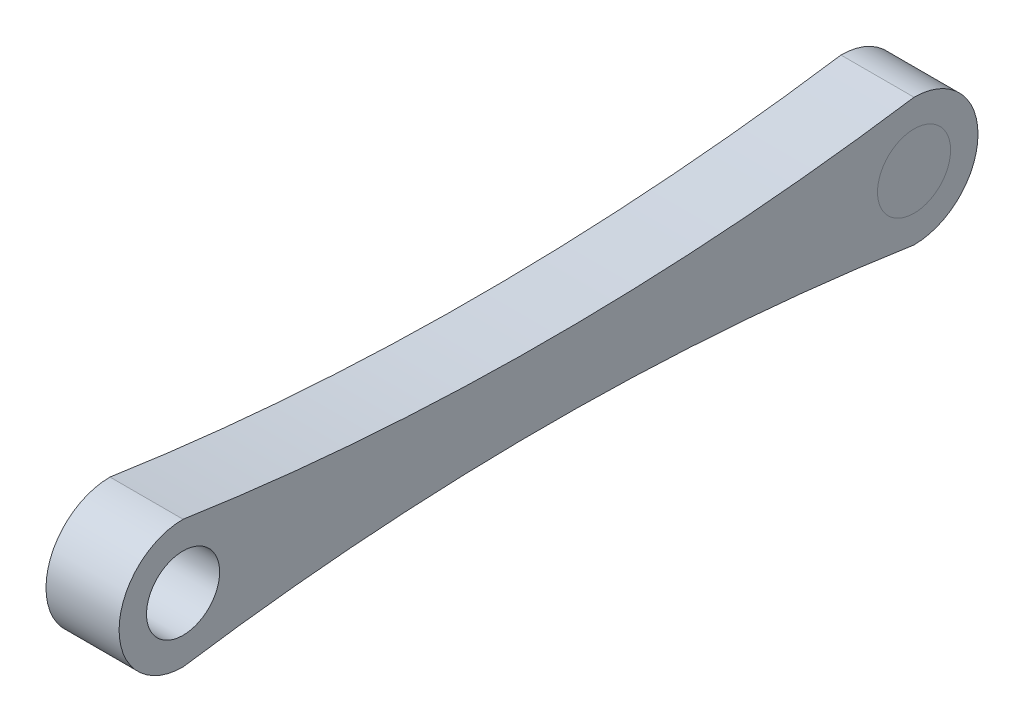
ISO-10303-21;
HEADER;
FILE_DESCRIPTION(('STEP AP214'),'2;1');
FILE_NAME('part.step','',(''),(''),'','','');
FILE_SCHEMA(('AUTOMOTIVE_DESIGN { 1 0 10303 214 1 1 1 1 }'));
ENDSEC;
DATA;
#1=APPLICATION_CONTEXT('core data for automotive mechanical design processes');
#2=APPLICATION_PROTOCOL_DEFINITION('international standard','automotive_design',2000,#1);
#3=PRODUCT_CONTEXT('',#1,'mechanical');
#4=PRODUCT('Part','Part','',(#3));
#5=PRODUCT_RELATED_PRODUCT_CATEGORY('part','',(#4));
#6=PRODUCT_DEFINITION_FORMATION('','',#4);
#7=PRODUCT_DEFINITION_CONTEXT('part definition',#1,'design');
#8=PRODUCT_DEFINITION('design','',#6,#7);
#9=PRODUCT_DEFINITION_SHAPE('','',#8);
#10=(LENGTH_UNIT() NAMED_UNIT(*) SI_UNIT(.MILLI.,.METRE.));
#11=(NAMED_UNIT(*) PLANE_ANGLE_UNIT() SI_UNIT($,.RADIAN.));
#12=(NAMED_UNIT(*) SI_UNIT($,.STERADIAN.) SOLID_ANGLE_UNIT());
#13=UNCERTAINTY_MEASURE_WITH_UNIT(LENGTH_MEASURE(1.E-05),#10,'distance_accuracy_value','');
#14=(GEOMETRIC_REPRESENTATION_CONTEXT(3) GLOBAL_UNCERTAINTY_ASSIGNED_CONTEXT((#13)) GLOBAL_UNIT_ASSIGNED_CONTEXT((#10,
#11,#12)) REPRESENTATION_CONTEXT('',''));
#15=CARTESIAN_POINT('',(0.,0.,0.));
#16=DIRECTION('',(0.,0.,1.));
#17=DIRECTION('',(1.,0.,0.));
#18=AXIS2_PLACEMENT_3D('',#15,#16,#17);
#19=CARTESIAN_POINT('',(-2.82842712474619,0.,-10.));
#20=DIRECTION('',(1.,0.,0.));
#21=DIRECTION('',(0.,0.,-1.));
#22=AXIS2_PLACEMENT_3D('',#19,#20,#21);
#23=CYLINDRICAL_SURFACE('',#22,1.);
#24=CARTESIAN_POINT('',(0.,0.,-10.));
#25=DIRECTION('',(1.,0.,0.));
#26=DIRECTION('',(0.,0.,-1.));
#27=AXIS2_PLACEMENT_3D('',#24,#25,#26);
#28=CIRCLE('',#27,1.);
#29=CARTESIAN_POINT('',(0.,0.,-11.));
#30=VERTEX_POINT('',#29);
#31=EDGE_CURVE('E11',#30,#30,#28,.F.);
#32=ORIENTED_EDGE('',*,*,#31,.F.);
#33=EDGE_LOOP('',(#32));
#34=FACE_BOUND('',#33,.T.);
#35=CARTESIAN_POINT('',(2.,0.,-10.));
#36=DIRECTION('',(1.,0.,0.));
#37=DIRECTION('',(0.,0.,-1.));
#38=AXIS2_PLACEMENT_3D('',#35,#36,#37);
#39=CIRCLE('',#38,1.);
#40=CARTESIAN_POINT('',(2.,0.,-11.));
#41=VERTEX_POINT('',#40);
#42=EDGE_CURVE('E53',#41,#41,#39,.T.);
#43=ORIENTED_EDGE('',*,*,#42,.F.);
#44=EDGE_LOOP('',(#43));
#45=FACE_BOUND('',#44,.T.);
#46=ADVANCED_FACE('F47',(#34,#45),#23,.T.);
#47=CARTESIAN_POINT('',(2.,0.,-10.));
#48=DIRECTION('',(1.,0.,0.));
#49=DIRECTION('',(0.,0.,-1.));
#50=AXIS2_PLACEMENT_3D('',#47,#48,#49);
#51=PLANE('',#50);
#52=ORIENTED_EDGE('',*,*,#42,.T.);
#53=EDGE_LOOP('',(#52));
#54=FACE_BOUND('',#53,.T.);
#55=ADVANCED_FACE('F59',(#54),#51,.T.);
#56=CARTESIAN_POINT('',(0.,34.0208333333335,-5.00000000000005));
#57=DIRECTION('',(1.,0.,0.));
#58=DIRECTION('',(0.,0.,-1.));
#59=AXIS2_PLACEMENT_3D('',#56,#57,#58);
#60=PLANE('',#59);
#61=ORIENTED_EDGE('',*,*,#31,.T.);
#62=EDGE_LOOP('',(#61));
#63=FACE_BOUND('',#62,.T.);
#64=ADVANCED_FACE('F66',(#63),#60,.F.);
#65=CLOSED_SHELL('',(#46,#55,#64));
#66=MANIFOLD_SOLID_BREP('B2',#65);
#67=CARTESIAN_POINT('',(2.,34.0208333333335,-5.00000000000005));
#68=DIRECTION('',(1.,0.,0.));
#69=DIRECTION('',(0.,0.,-1.));
#70=AXIS2_PLACEMENT_3D('',#67,#68,#69);
#71=PLANE('',#70);
#72=CARTESIAN_POINT('',(2.,0.,9.99999999999995));
#73=DIRECTION('',(1.,0.,0.));
#74=DIRECTION('',(0.,0.,-1.));
#75=AXIS2_PLACEMENT_3D('',#72,#73,#74);
#76=CIRCLE('',#75,1.);
#77=CARTESIAN_POINT('',(2.,0.,8.99999999999995));
#78=VERTEX_POINT('',#77);
#79=EDGE_CURVE('E155',#78,#78,#76,.T.);
#80=ORIENTED_EDGE('',*,*,#79,.F.);
#81=EDGE_LOOP('',(#80));
#82=FACE_BOUND('',#81,.T.);
#83=CARTESIAN_POINT('',(2.,68.041666666667,0.));
#84=DIRECTION('',(-1.,0.,0.));
#85=DIRECTION('',(0.,0.,-1.));
#86=AXIS2_PLACEMENT_3D('',#83,#84,#85);
#87=CIRCLE('',#86,67.041666666667);
#88=CARTESIAN_POINT('',(2.,1.74999999999999,-10.));
#89=VERTEX_POINT('',#88);
#90=CARTESIAN_POINT('',(2.,1.74999999999999,9.99999999999995));
#91=VERTEX_POINT('',#90);
#92=EDGE_CURVE('E140',#89,#91,#87,.T.);
#93=ORIENTED_EDGE('',*,*,#92,.T.);
#94=CARTESIAN_POINT('',(2.,0.,9.99999999999995));
#95=DIRECTION('',(1.,0.,0.));
#96=DIRECTION('',(0.,0.,-1.));
#97=AXIS2_PLACEMENT_3D('',#94,#95,#96);
#98=CIRCLE('',#97,1.75);
#99=CARTESIAN_POINT('',(2.,-1.75000000000001,9.99999999999995));
#100=VERTEX_POINT('',#99);
#101=EDGE_CURVE('E135',#91,#100,#98,.T.);
#102=ORIENTED_EDGE('',*,*,#101,.T.);
#103=CARTESIAN_POINT('',(2.,-68.041666666667,0.));
#104=DIRECTION('',(-1.,0.,0.));
#105=DIRECTION('',(0.,0.,1.));
#106=AXIS2_PLACEMENT_3D('',#103,#104,#105);
#107=CIRCLE('',#106,67.041666666667);
#108=CARTESIAN_POINT('',(2.,-1.75000000000002,-10.0000000000001));
#109=VERTEX_POINT('',#108);
#110=EDGE_CURVE('E138',#100,#109,#107,.T.);
#111=ORIENTED_EDGE('',*,*,#110,.T.);
#112=CARTESIAN_POINT('',(2.,0.,-10.));
#113=DIRECTION('',(1.,0.,0.));
#114=DIRECTION('',(0.,0.,-1.));
#115=AXIS2_PLACEMENT_3D('',#112,#113,#114);
#116=CIRCLE('',#115,1.75);
#117=EDGE_CURVE('E105',#109,#89,#116,.T.);
#118=ORIENTED_EDGE('',*,*,#117,.T.);
#119=EDGE_LOOP('',(#93,#102,#111,#118));
#120=FACE_BOUND('',#119,.T.);
#121=CARTESIAN_POINT('',(2.,0.,-10.));
#122=DIRECTION('',(1.,0.,0.));
#123=DIRECTION('',(0.,0.,-1.));
#124=AXIS2_PLACEMENT_3D('',#121,#122,#123);
#125=CIRCLE('',#124,1.);
#126=CARTESIAN_POINT('',(2.,0.,-11.));
#127=VERTEX_POINT('',#126);
#128=EDGE_CURVE('E170',#127,#127,#125,.T.);
#129=ORIENTED_EDGE('',*,*,#128,.F.);
#130=EDGE_LOOP('',(#129));
#131=FACE_BOUND('',#130,.T.);
#132=ADVANCED_FACE('F88',(#82,#120,#131),#71,.T.);
#133=CARTESIAN_POINT('',(0.,34.0208333333335,-5.00000000000005));
#134=DIRECTION('',(1.,0.,0.));
#135=DIRECTION('',(0.,0.,-1.));
#136=AXIS2_PLACEMENT_3D('',#133,#134,#135);
#137=PLANE('',#136);
#138=CARTESIAN_POINT('',(0.,68.041666666667,0.));
#139=DIRECTION('',(-1.,0.,0.));
#140=DIRECTION('',(0.,0.,-1.));
#141=AXIS2_PLACEMENT_3D('',#138,#139,#140);
#142=CIRCLE('',#141,67.041666666667);
#143=CARTESIAN_POINT('',(0.,1.74999999999999,-10.));
#144=VERTEX_POINT('',#143);
#145=CARTESIAN_POINT('',(0.,1.74999999999999,9.99999999999995));
#146=VERTEX_POINT('',#145);
#147=EDGE_CURVE('E152',#144,#146,#142,.T.);
#148=ORIENTED_EDGE('',*,*,#147,.F.);
#149=CARTESIAN_POINT('',(0.,0.,-10.));
#150=DIRECTION('',(1.,0.,0.));
#151=DIRECTION('',(0.,0.,-1.));
#152=AXIS2_PLACEMENT_3D('',#149,#150,#151);
#153=CIRCLE('',#152,1.75);
#154=CARTESIAN_POINT('',(0.,-1.75000000000002,-10.0000000000001));
#155=VERTEX_POINT('',#154);
#156=EDGE_CURVE('E128',#155,#144,#153,.T.);
#157=ORIENTED_EDGE('',*,*,#156,.F.);
#158=CARTESIAN_POINT('',(0.,-68.041666666667,0.));
#159=DIRECTION('',(-1.,0.,0.));
#160=DIRECTION('',(0.,0.,1.));
#161=AXIS2_PLACEMENT_3D('',#158,#159,#160);
#162=CIRCLE('',#161,67.041666666667);
#163=CARTESIAN_POINT('',(0.,-1.75000000000001,9.99999999999995));
#164=VERTEX_POINT('',#163);
#165=EDGE_CURVE('E122',#164,#155,#162,.T.);
#166=ORIENTED_EDGE('',*,*,#165,.F.);
#167=CARTESIAN_POINT('',(0.,0.,9.99999999999995));
#168=DIRECTION('',(1.,0.,0.));
#169=DIRECTION('',(0.,0.,-1.));
#170=AXIS2_PLACEMENT_3D('',#167,#168,#169);
#171=CIRCLE('',#170,1.75);
#172=EDGE_CURVE('E144',#146,#164,#171,.T.);
#173=ORIENTED_EDGE('',*,*,#172,.F.);
#174=EDGE_LOOP('',(#148,#157,#166,#173));
#175=FACE_BOUND('',#174,.T.);
#176=CARTESIAN_POINT('',(0.,0.,9.99999999999995));
#177=DIRECTION('',(1.,0.,0.));
#178=DIRECTION('',(0.,0.,-1.));
#179=AXIS2_PLACEMENT_3D('',#176,#177,#178);
#180=CIRCLE('',#179,1.);
#181=CARTESIAN_POINT('',(0.,0.,8.99999999999995));
#182=VERTEX_POINT('',#181);
#183=EDGE_CURVE('E167',#182,#182,#180,.T.);
#184=ORIENTED_EDGE('',*,*,#183,.T.);
#185=EDGE_LOOP('',(#184));
#186=FACE_BOUND('',#185,.T.);
#187=CARTESIAN_POINT('',(0.,0.,-10.));
#188=DIRECTION('',(1.,0.,0.));
#189=DIRECTION('',(0.,0.,-1.));
#190=AXIS2_PLACEMENT_3D('',#187,#188,#189);
#191=CIRCLE('',#190,1.);
#192=CARTESIAN_POINT('',(0.,0.,-11.));
#193=VERTEX_POINT('',#192);
#194=EDGE_CURVE('E173',#193,#193,#191,.T.);
#195=ORIENTED_EDGE('',*,*,#194,.T.);
#196=EDGE_LOOP('',(#195));
#197=FACE_BOUND('',#196,.T.);
#198=ADVANCED_FACE('F163',(#175,#186,#197),#137,.F.);
#199=CARTESIAN_POINT('',(2.,68.041666666667,0.));
#200=DIRECTION('',(-1.,0.,0.));
#201=DIRECTION('',(0.,0.,1.));
#202=AXIS2_PLACEMENT_3D('',#199,#200,#201);
#203=CYLINDRICAL_SURFACE('',#202,67.041666666667);
#204=ORIENTED_EDGE('',*,*,#147,.T.);
#205=DIRECTION('',(-1.,0.,0.));
#206=VECTOR('',#205,1.);
#207=CARTESIAN_POINT('',(2.,1.74999999999999,9.99999999999995));
#208=LINE('',#207,#206);
#209=EDGE_CURVE('E45',#91,#146,#208,.T.);
#210=ORIENTED_EDGE('',*,*,#209,.F.);
#211=ORIENTED_EDGE('',*,*,#92,.F.);
#212=DIRECTION('',(-1.,0.,0.));
#213=VECTOR('',#212,1.);
#214=CARTESIAN_POINT('',(2.,1.74999999999999,-10.));
#215=LINE('',#214,#213);
#216=EDGE_CURVE('E148',#89,#144,#215,.T.);
#217=ORIENTED_EDGE('',*,*,#216,.T.);
#218=EDGE_LOOP('',(#204,#210,#211,#217));
#219=FACE_BOUND('',#218,.T.);
#220=ADVANCED_FACE('F90',(#219),#203,.F.);
#221=CARTESIAN_POINT('',(2.,0.,9.99999999999995));
#222=DIRECTION('',(-1.,0.,0.));
#223=DIRECTION('',(0.,0.,1.));
#224=AXIS2_PLACEMENT_3D('',#221,#222,#223);
#225=CYLINDRICAL_SURFACE('',#224,1.75);
#226=ORIENTED_EDGE('',*,*,#172,.T.);
#227=DIRECTION('',(-1.,0.,0.));
#228=VECTOR('',#227,1.);
#229=CARTESIAN_POINT('',(2.,-1.75000000000001,9.99999999999995));
#230=LINE('',#229,#228);
#231=EDGE_CURVE('E97',#100,#164,#230,.T.);
#232=ORIENTED_EDGE('',*,*,#231,.F.);
#233=ORIENTED_EDGE('',*,*,#101,.F.);
#234=ORIENTED_EDGE('',*,*,#209,.T.);
#235=EDGE_LOOP('',(#226,#232,#233,#234));
#236=FACE_BOUND('',#235,.T.);
#237=ADVANCED_FACE('F143',(#236),#225,.T.);
#238=CARTESIAN_POINT('',(2.,-68.041666666667,0.));
#239=DIRECTION('',(-1.,0.,0.));
#240=DIRECTION('',(0.,0.,1.));
#241=AXIS2_PLACEMENT_3D('',#238,#239,#240);
#242=CYLINDRICAL_SURFACE('',#241,67.041666666667);
#243=ORIENTED_EDGE('',*,*,#165,.T.);
#244=DIRECTION('',(-1.,0.,0.));
#245=VECTOR('',#244,1.);
#246=CARTESIAN_POINT('',(2.,-1.75000000000002,-10.0000000000001));
#247=LINE('',#246,#245);
#248=EDGE_CURVE('E145',#109,#155,#247,.T.);
#249=ORIENTED_EDGE('',*,*,#248,.F.);
#250=ORIENTED_EDGE('',*,*,#110,.F.);
#251=ORIENTED_EDGE('',*,*,#231,.T.);
#252=EDGE_LOOP('',(#243,#249,#250,#251));
#253=FACE_BOUND('',#252,.T.);
#254=ADVANCED_FACE('F146',(#253),#242,.F.);
#255=CARTESIAN_POINT('',(2.,0.,-10.));
#256=DIRECTION('',(-1.,0.,0.));
#257=DIRECTION('',(0.,0.,1.));
#258=AXIS2_PLACEMENT_3D('',#255,#256,#257);
#259=CYLINDRICAL_SURFACE('',#258,1.75);
#260=ORIENTED_EDGE('',*,*,#156,.T.);
#261=ORIENTED_EDGE('',*,*,#216,.F.);
#262=ORIENTED_EDGE('',*,*,#117,.F.);
#263=ORIENTED_EDGE('',*,*,#248,.T.);
#264=EDGE_LOOP('',(#260,#261,#262,#263));
#265=FACE_BOUND('',#264,.T.);
#266=ADVANCED_FACE('F160',(#265),#259,.T.);
#267=CARTESIAN_POINT('',(2.,0.,9.99999999999995));
#268=DIRECTION('',(-1.,0.,0.));
#269=DIRECTION('',(0.,0.,1.));
#270=AXIS2_PLACEMENT_3D('',#267,#268,#269);
#271=CYLINDRICAL_SURFACE('',#270,1.);
#272=ORIENTED_EDGE('',*,*,#79,.T.);
#273=EDGE_LOOP('',(#272));
#274=FACE_BOUND('',#273,.T.);
#275=ORIENTED_EDGE('',*,*,#183,.F.);
#276=EDGE_LOOP('',(#275));
#277=FACE_BOUND('',#276,.T.);
#278=ADVANCED_FACE('F190',(#274,#277),#271,.F.);
#279=CARTESIAN_POINT('',(2.,0.,-10.));
#280=DIRECTION('',(-1.,0.,0.));
#281=DIRECTION('',(0.,0.,1.));
#282=AXIS2_PLACEMENT_3D('',#279,#280,#281);
#283=CYLINDRICAL_SURFACE('',#282,1.);
#284=ORIENTED_EDGE('',*,*,#128,.T.);
#285=EDGE_LOOP('',(#284));
#286=FACE_BOUND('',#285,.T.);
#287=ORIENTED_EDGE('',*,*,#194,.F.);
#288=EDGE_LOOP('',(#287));
#289=FACE_BOUND('',#288,.T.);
#290=ADVANCED_FACE('F179',(#286,#289),#283,.F.);
#291=CLOSED_SHELL('',(#132,#198,#220,#237,#254,#266,#278,#290));
#292=MANIFOLD_SOLID_BREP('B6',#291);
#293=ADVANCED_BREP_SHAPE_REPRESENTATION('',(#18,#66,#292),#14);
#294=SHAPE_DEFINITION_REPRESENTATION(#9,#293);
ENDSEC;
END-ISO-10303-21;
